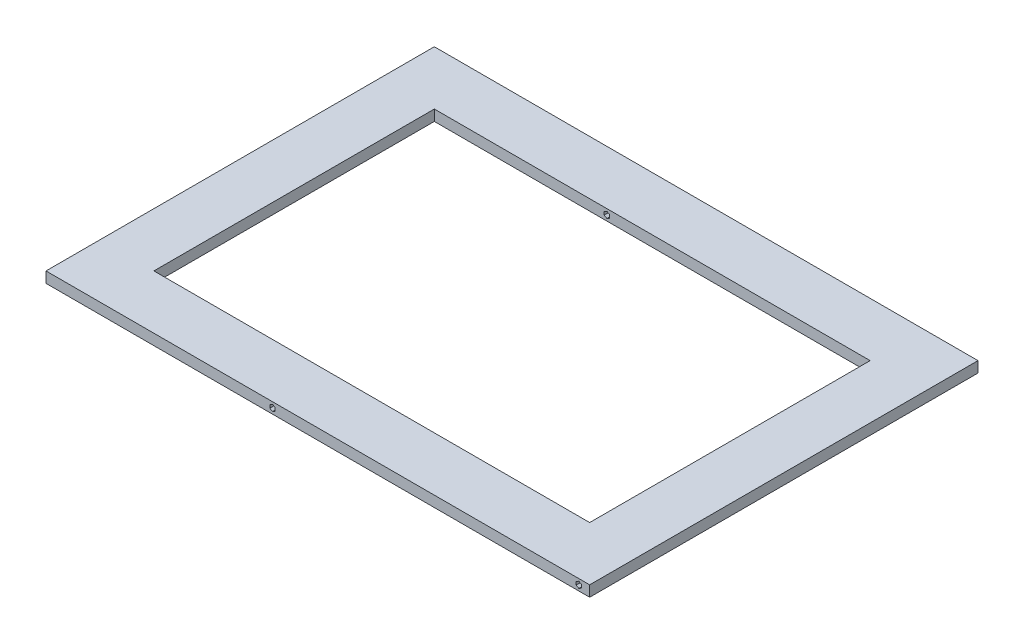
ISO-10303-21;
HEADER;
FILE_DESCRIPTION(('STEP AP214'),'2;1');
FILE_NAME('part.step','',(''),(''),'','','');
FILE_SCHEMA(('AUTOMOTIVE_DESIGN { 1 0 10303 214 1 1 1 1 }'));
ENDSEC;
DATA;
#1=APPLICATION_CONTEXT('core data for automotive mechanical design processes');
#2=APPLICATION_PROTOCOL_DEFINITION('international standard','automotive_design',2000,#1);
#3=PRODUCT_CONTEXT('',#1,'mechanical');
#4=PRODUCT('Part','Part','',(#3));
#5=PRODUCT_RELATED_PRODUCT_CATEGORY('part','',(#4));
#6=PRODUCT_DEFINITION_FORMATION('','',#4);
#7=PRODUCT_DEFINITION_CONTEXT('part definition',#1,'design');
#8=PRODUCT_DEFINITION('design','',#6,#7);
#9=PRODUCT_DEFINITION_SHAPE('','',#8);
#10=(LENGTH_UNIT() NAMED_UNIT(*) SI_UNIT(.MILLI.,.METRE.));
#11=(NAMED_UNIT(*) PLANE_ANGLE_UNIT() SI_UNIT($,.RADIAN.));
#12=(NAMED_UNIT(*) SI_UNIT($,.STERADIAN.) SOLID_ANGLE_UNIT());
#13=UNCERTAINTY_MEASURE_WITH_UNIT(LENGTH_MEASURE(1.E-05),#10,'distance_accuracy_value','');
#14=(GEOMETRIC_REPRESENTATION_CONTEXT(3) GLOBAL_UNCERTAINTY_ASSIGNED_CONTEXT((#13)) GLOBAL_UNIT_ASSIGNED_CONTEXT((#10,
#11,#12)) REPRESENTATION_CONTEXT('',''));
#15=CARTESIAN_POINT('',(0.,0.,0.));
#16=DIRECTION('',(0.,0.,1.));
#17=DIRECTION('',(1.,0.,0.));
#18=AXIS2_PLACEMENT_3D('',#15,#16,#17);
#19=CARTESIAN_POINT('',(-19.75,0.721687836487036,-90.));
#20=DIRECTION('',(0.499999999999999,0.866025403784439,0.));
#21=DIRECTION('',(-0.866025403784439,0.499999999999999,0.));
#22=AXIS2_PLACEMENT_3D('',#19,#20,#21);
#23=PLANE('',#22);
#24=DIRECTION('',(0.,0.,1.));
#25=VECTOR('',#24,1.);
#26=CARTESIAN_POINT('',(-19.75,0.721687836487036,-90.));
#27=LINE('',#26,#25);
#28=CARTESIAN_POINT('',(-19.75,0.721687836487036,-90.));
#29=VERTEX_POINT('',#28);
#30=CARTESIAN_POINT('',(-19.75,0.721687836487036,-65.));
#31=VERTEX_POINT('',#30);
#32=EDGE_CURVE('E340',#29,#31,#27,.T.);
#33=ORIENTED_EDGE('',*,*,#32,.T.);
#34=DIRECTION('',(-0.866025403784439,0.499999999999999,0.));
#35=VECTOR('',#34,1.);
#36=CARTESIAN_POINT('',(-19.75,0.721687836487036,-65.));
#37=LINE('',#36,#35);
#38=CARTESIAN_POINT('',(-21.0000000000001,1.44337567297409,-65.));
#39=VERTEX_POINT('',#38);
#40=EDGE_CURVE('E298',#31,#39,#37,.T.);
#41=ORIENTED_EDGE('',*,*,#40,.T.);
#42=DIRECTION('',(0.,0.,1.));
#43=VECTOR('',#42,1.);
#44=CARTESIAN_POINT('',(-21.0000000000001,1.44337567297409,-90.));
#45=LINE('',#44,#43);
#46=CARTESIAN_POINT('',(-21.0000000000001,1.44337567297409,-90.));
#47=VERTEX_POINT('',#46);
#48=EDGE_CURVE('E361',#47,#39,#45,.T.);
#49=ORIENTED_EDGE('',*,*,#48,.F.);
#50=DIRECTION('',(-0.866025403784439,0.499999999999999,0.));
#51=VECTOR('',#50,1.);
#52=CARTESIAN_POINT('',(-19.75,0.721687836487036,-90.));
#53=LINE('',#52,#51);
#54=EDGE_CURVE('E302',#29,#47,#53,.T.);
#55=ORIENTED_EDGE('',*,*,#54,.F.);
#56=EDGE_LOOP('',(#33,#41,#49,#55));
#57=FACE_BOUND('',#56,.T.);
#58=ADVANCED_FACE('F45',(#57),#23,.F.);
#59=CARTESIAN_POINT('',(-19.75,-0.721687836487042,-90.));
#60=DIRECTION('',(1.,0.,0.));
#61=DIRECTION('',(0.,0.,-1.));
#62=AXIS2_PLACEMENT_3D('',#59,#60,#61);
#63=PLANE('',#62);
#64=DIRECTION('',(0.,0.,1.));
#65=VECTOR('',#64,1.);
#66=CARTESIAN_POINT('',(-19.75,-0.721687836487042,-90.));
#67=LINE('',#66,#65);
#68=CARTESIAN_POINT('',(-19.75,-0.721687836487042,-90.));
#69=VERTEX_POINT('',#68);
#70=CARTESIAN_POINT('',(-19.75,-0.721687836487042,-65.));
#71=VERTEX_POINT('',#70);
#72=EDGE_CURVE('E345',#69,#71,#67,.T.);
#73=ORIENTED_EDGE('',*,*,#72,.T.);
#74=DIRECTION('',(0.,1.,0.));
#75=VECTOR('',#74,1.);
#76=CARTESIAN_POINT('',(-19.75,-0.721687836487042,-65.));
#77=LINE('',#76,#75);
#78=EDGE_CURVE('E295',#71,#31,#77,.T.);
#79=ORIENTED_EDGE('',*,*,#78,.T.);
#80=ORIENTED_EDGE('',*,*,#32,.F.);
#81=DIRECTION('',(0.,1.,0.));
#82=VECTOR('',#81,1.);
#83=CARTESIAN_POINT('',(-19.75,-0.721687836487042,-90.));
#84=LINE('',#83,#82);
#85=EDGE_CURVE('E318',#69,#29,#84,.T.);
#86=ORIENTED_EDGE('',*,*,#85,.F.);
#87=EDGE_LOOP('',(#73,#79,#80,#86));
#88=FACE_BOUND('',#87,.T.);
#89=ADVANCED_FACE('F498',(#88),#63,.F.);
#90=CARTESIAN_POINT('',(-21.0000000000001,-1.44337567297406,-90.));
#91=DIRECTION('',(0.49999999999998,-0.86602540378445,0.));
#92=DIRECTION('',(0.86602540378445,0.49999999999998,0.));
#93=AXIS2_PLACEMENT_3D('',#90,#91,#92);
#94=PLANE('',#93);
#95=DIRECTION('',(0.,0.,1.));
#96=VECTOR('',#95,1.);
#97=CARTESIAN_POINT('',(-21.0000000000001,-1.44337567297406,-90.));
#98=LINE('',#97,#96);
#99=CARTESIAN_POINT('',(-21.0000000000001,-1.44337567297406,-90.));
#100=VERTEX_POINT('',#99);
#101=CARTESIAN_POINT('',(-21.0000000000001,-1.44337567297406,-65.));
#102=VERTEX_POINT('',#101);
#103=EDGE_CURVE('E349',#100,#102,#98,.T.);
#104=ORIENTED_EDGE('',*,*,#103,.T.);
#105=DIRECTION('',(0.86602540378445,0.49999999999998,0.));
#106=VECTOR('',#105,1.);
#107=CARTESIAN_POINT('',(-21.0000000000001,-1.44337567297406,-65.));
#108=LINE('',#107,#106);
#109=EDGE_CURVE('E292',#102,#71,#108,.T.);
#110=ORIENTED_EDGE('',*,*,#109,.T.);
#111=ORIENTED_EDGE('',*,*,#72,.F.);
#112=DIRECTION('',(0.86602540378445,0.49999999999998,0.));
#113=VECTOR('',#112,1.);
#114=CARTESIAN_POINT('',(-21.0000000000001,-1.44337567297406,-90.));
#115=LINE('',#114,#113);
#116=EDGE_CURVE('E315',#100,#69,#115,.T.);
#117=ORIENTED_EDGE('',*,*,#116,.F.);
#118=EDGE_LOOP('',(#104,#110,#111,#117));
#119=FACE_BOUND('',#118,.T.);
#120=ADVANCED_FACE('F504',(#119),#94,.F.);
#121=CARTESIAN_POINT('',(-22.2500000000001,-0.721687836487034,-90.));
#122=DIRECTION('',(-0.5,-0.866025403784438,0.));
#123=DIRECTION('',(0.866025403784439,-0.5,0.));
#124=AXIS2_PLACEMENT_3D('',#121,#122,#123);
#125=PLANE('',#124);
#126=DIRECTION('',(0.,0.,1.));
#127=VECTOR('',#126,1.);
#128=CARTESIAN_POINT('',(-22.2500000000001,-0.721687836487034,-90.));
#129=LINE('',#128,#127);
#130=CARTESIAN_POINT('',(-22.2500000000001,-0.721687836487034,-90.));
#131=VERTEX_POINT('',#130);
#132=CARTESIAN_POINT('',(-22.2500000000001,-0.721687836487034,-65.));
#133=VERTEX_POINT('',#132);
#134=EDGE_CURVE('E353',#131,#133,#129,.T.);
#135=ORIENTED_EDGE('',*,*,#134,.T.);
#136=DIRECTION('',(0.866025403784439,-0.5,0.));
#137=VECTOR('',#136,1.);
#138=CARTESIAN_POINT('',(-22.2500000000001,-0.721687836487034,-65.));
#139=LINE('',#138,#137);
#140=EDGE_CURVE('E289',#133,#102,#139,.T.);
#141=ORIENTED_EDGE('',*,*,#140,.T.);
#142=ORIENTED_EDGE('',*,*,#103,.F.);
#143=DIRECTION('',(0.866025403784439,-0.5,0.));
#144=VECTOR('',#143,1.);
#145=CARTESIAN_POINT('',(-22.2500000000001,-0.721687836487034,-90.));
#146=LINE('',#145,#144);
#147=EDGE_CURVE('E312',#131,#100,#146,.T.);
#148=ORIENTED_EDGE('',*,*,#147,.F.);
#149=EDGE_LOOP('',(#135,#141,#142,#148));
#150=FACE_BOUND('',#149,.T.);
#151=ADVANCED_FACE('F581',(#150),#125,.F.);
#152=CARTESIAN_POINT('',(-22.2500000000001,0.72168783648705,-90.));
#153=DIRECTION('',(-1.,0.,0.));
#154=DIRECTION('',(0.,-1.,0.));
#155=AXIS2_PLACEMENT_3D('',#152,#153,#154);
#156=PLANE('',#155);
#157=DIRECTION('',(0.,0.,1.));
#158=VECTOR('',#157,1.);
#159=CARTESIAN_POINT('',(-22.2500000000001,0.72168783648705,-90.));
#160=LINE('',#159,#158);
#161=CARTESIAN_POINT('',(-22.2500000000001,0.72168783648705,-90.));
#162=VERTEX_POINT('',#161);
#163=CARTESIAN_POINT('',(-22.2500000000001,0.72168783648705,-65.));
#164=VERTEX_POINT('',#163);
#165=EDGE_CURVE('E357',#162,#164,#160,.T.);
#166=ORIENTED_EDGE('',*,*,#165,.T.);
#167=DIRECTION('',(0.,-1.,0.));
#168=VECTOR('',#167,1.);
#169=CARTESIAN_POINT('',(-22.2500000000001,0.72168783648705,-65.));
#170=LINE('',#169,#168);
#171=EDGE_CURVE('E286',#164,#133,#170,.T.);
#172=ORIENTED_EDGE('',*,*,#171,.T.);
#173=ORIENTED_EDGE('',*,*,#134,.F.);
#174=DIRECTION('',(0.,-1.,0.));
#175=VECTOR('',#174,1.);
#176=CARTESIAN_POINT('',(-22.2500000000001,0.72168783648705,-90.));
#177=LINE('',#176,#175);
#178=EDGE_CURVE('E309',#162,#131,#177,.T.);
#179=ORIENTED_EDGE('',*,*,#178,.F.);
#180=EDGE_LOOP('',(#166,#172,#173,#179));
#181=FACE_BOUND('',#180,.T.);
#182=ADVANCED_FACE('F576',(#181),#156,.F.);
#183=CARTESIAN_POINT('',(-21.0000000000001,1.44337567297409,-90.));
#184=DIRECTION('',(-0.5,0.866025403784438,0.));
#185=DIRECTION('',(-0.866025403784439,-0.5,0.));
#186=AXIS2_PLACEMENT_3D('',#183,#184,#185);
#187=PLANE('',#186);
#188=ORIENTED_EDGE('',*,*,#48,.T.);
#189=DIRECTION('',(-0.866025403784439,-0.5,0.));
#190=VECTOR('',#189,1.);
#191=CARTESIAN_POINT('',(-21.0000000000001,1.44337567297409,-65.));
#192=LINE('',#191,#190);
#193=EDGE_CURVE('E11',#39,#164,#192,.T.);
#194=ORIENTED_EDGE('',*,*,#193,.T.);
#195=ORIENTED_EDGE('',*,*,#165,.F.);
#196=DIRECTION('',(-0.866025403784438,-0.5,0.));
#197=VECTOR('',#196,1.);
#198=CARTESIAN_POINT('',(-21.0000000000001,1.44337567297409,-90.));
#199=LINE('',#198,#197);
#200=EDGE_CURVE('E305',#47,#162,#199,.T.);
#201=ORIENTED_EDGE('',*,*,#200,.F.);
#202=EDGE_LOOP('',(#188,#194,#195,#201));
#203=FACE_BOUND('',#202,.T.);
#204=ADVANCED_FACE('F572',(#203),#187,.F.);
#205=CARTESIAN_POINT('',(126.,-2.5,-90.));
#206=DIRECTION('',(1.,0.,0.));
#207=DIRECTION('',(0.,0.,-1.));
#208=AXIS2_PLACEMENT_3D('',#205,#206,#207);
#209=PLANE('',#208);
#210=DIRECTION('',(0.,0.,1.));
#211=VECTOR('',#210,1.);
#212=CARTESIAN_POINT('',(126.,2.5,-90.));
#213=LINE('',#212,#211);
#214=CARTESIAN_POINT('',(126.,2.5,-90.));
#215=VERTEX_POINT('',#214);
#216=CARTESIAN_POINT('',(126.,2.5,90.));
#217=VERTEX_POINT('',#216);
#218=EDGE_CURVE('E457',#215,#217,#213,.T.);
#219=ORIENTED_EDGE('',*,*,#218,.T.);
#220=DIRECTION('',(0.,1.,0.));
#221=VECTOR('',#220,1.);
#222=CARTESIAN_POINT('',(126.,-2.5,90.));
#223=LINE('',#222,#221);
#224=CARTESIAN_POINT('',(126.,-2.5,90.));
#225=VERTEX_POINT('',#224);
#226=EDGE_CURVE('E343',#225,#217,#223,.T.);
#227=ORIENTED_EDGE('',*,*,#226,.F.);
#228=DIRECTION('',(0.,0.,1.));
#229=VECTOR('',#228,1.);
#230=CARTESIAN_POINT('',(126.,-2.5,-90.));
#231=LINE('',#230,#229);
#232=CARTESIAN_POINT('',(126.,-2.5,-90.));
#233=VERTEX_POINT('',#232);
#234=EDGE_CURVE('E458',#233,#225,#231,.T.);
#235=ORIENTED_EDGE('',*,*,#234,.F.);
#236=DIRECTION('',(0.,1.,0.));
#237=VECTOR('',#236,1.);
#238=CARTESIAN_POINT('',(126.,-2.5,-90.));
#239=LINE('',#238,#237);
#240=EDGE_CURVE('E442',#233,#215,#239,.T.);
#241=ORIENTED_EDGE('',*,*,#240,.T.);
#242=EDGE_LOOP('',(#219,#227,#235,#241));
#243=FACE_BOUND('',#242,.T.);
#244=ADVANCED_FACE('F47',(#243),#209,.T.);
#245=CARTESIAN_POINT('',(-126.,-2.5,-90.));
#246=DIRECTION('',(0.,-1.,0.));
#247=DIRECTION('',(0.,0.,-1.));
#248=AXIS2_PLACEMENT_3D('',#245,#246,#247);
#249=PLANE('',#248);
#250=DIRECTION('',(-1.,0.,0.));
#251=VECTOR('',#250,1.);
#252=CARTESIAN_POINT('',(101.,-2.5,-65.));
#253=LINE('',#252,#251);
#254=CARTESIAN_POINT('',(101.,-2.5,-65.));
#255=VERTEX_POINT('',#254);
#256=CARTESIAN_POINT('',(-101.,-2.5,-65.));
#257=VERTEX_POINT('',#256);
#258=EDGE_CURVE('E237',#255,#257,#253,.T.);
#259=ORIENTED_EDGE('',*,*,#258,.T.);
#260=DIRECTION('',(0.,0.,1.));
#261=VECTOR('',#260,1.);
#262=CARTESIAN_POINT('',(-101.,-2.5,-65.));
#263=LINE('',#262,#261);
#264=CARTESIAN_POINT('',(-101.,-2.5,65.));
#265=VERTEX_POINT('',#264);
#266=EDGE_CURVE('E246',#257,#265,#263,.T.);
#267=ORIENTED_EDGE('',*,*,#266,.T.);
#268=DIRECTION('',(1.,0.,0.));
#269=VECTOR('',#268,1.);
#270=CARTESIAN_POINT('',(-101.,-2.5,65.));
#271=LINE('',#270,#269);
#272=CARTESIAN_POINT('',(101.,-2.5,65.));
#273=VERTEX_POINT('',#272);
#274=EDGE_CURVE('E60',#265,#273,#271,.T.);
#275=ORIENTED_EDGE('',*,*,#274,.T.);
#276=DIRECTION('',(0.,0.,-1.));
#277=VECTOR('',#276,1.);
#278=CARTESIAN_POINT('',(101.,-2.5,65.));
#279=LINE('',#278,#277);
#280=EDGE_CURVE('E243',#273,#255,#279,.T.);
#281=ORIENTED_EDGE('',*,*,#280,.T.);
#282=EDGE_LOOP('',(#259,#267,#275,#281));
#283=FACE_BOUND('',#282,.T.);
#284=ORIENTED_EDGE('',*,*,#234,.T.);
#285=DIRECTION('',(1.,0.,0.));
#286=VECTOR('',#285,1.);
#287=CARTESIAN_POINT('',(-126.,-2.5,90.));
#288=LINE('',#287,#286);
#289=CARTESIAN_POINT('',(-126.,-2.5,90.));
#290=VERTEX_POINT('',#289);
#291=EDGE_CURVE('E438',#290,#225,#288,.T.);
#292=ORIENTED_EDGE('',*,*,#291,.F.);
#293=DIRECTION('',(0.,0.,1.));
#294=VECTOR('',#293,1.);
#295=CARTESIAN_POINT('',(-126.,-2.5,-90.));
#296=LINE('',#295,#294);
#297=CARTESIAN_POINT('',(-126.,-2.5,-90.));
#298=VERTEX_POINT('',#297);
#299=EDGE_CURVE('E461',#298,#290,#296,.T.);
#300=ORIENTED_EDGE('',*,*,#299,.F.);
#301=DIRECTION('',(1.,0.,0.));
#302=VECTOR('',#301,1.);
#303=CARTESIAN_POINT('',(-126.,-2.5,-90.));
#304=LINE('',#303,#302);
#305=EDGE_CURVE('E453',#298,#233,#304,.T.);
#306=ORIENTED_EDGE('',*,*,#305,.T.);
#307=EDGE_LOOP('',(#284,#292,#300,#306));
#308=FACE_BOUND('',#307,.T.);
#309=ADVANCED_FACE('F250',(#283,#308),#249,.T.);
#310=CARTESIAN_POINT('',(-126.,-2.5,-90.));
#311=DIRECTION('',(-1.,0.,0.));
#312=DIRECTION('',(0.,0.,1.));
#313=AXIS2_PLACEMENT_3D('',#310,#311,#312);
#314=PLANE('',#313);
#315=ORIENTED_EDGE('',*,*,#299,.T.);
#316=DIRECTION('',(0.,-1.,0.));
#317=VECTOR('',#316,1.);
#318=CARTESIAN_POINT('',(-126.,-2.5,90.));
#319=LINE('',#318,#317);
#320=CARTESIAN_POINT('',(-126.,2.5,90.));
#321=VERTEX_POINT('',#320);
#322=EDGE_CURVE('E435',#321,#290,#319,.T.);
#323=ORIENTED_EDGE('',*,*,#322,.F.);
#324=DIRECTION('',(0.,0.,1.));
#325=VECTOR('',#324,1.);
#326=CARTESIAN_POINT('',(-126.,2.5,-90.));
#327=LINE('',#326,#325);
#328=CARTESIAN_POINT('',(-126.,2.5,-90.));
#329=VERTEX_POINT('',#328);
#330=EDGE_CURVE('E463',#329,#321,#327,.T.);
#331=ORIENTED_EDGE('',*,*,#330,.F.);
#332=DIRECTION('',(0.,-1.,0.));
#333=VECTOR('',#332,1.);
#334=CARTESIAN_POINT('',(-126.,-2.5,-90.));
#335=LINE('',#334,#333);
#336=EDGE_CURVE('E450',#329,#298,#335,.T.);
#337=ORIENTED_EDGE('',*,*,#336,.T.);
#338=EDGE_LOOP('',(#315,#323,#331,#337));
#339=FACE_BOUND('',#338,.T.);
#340=ADVANCED_FACE('F550',(#339),#314,.T.);
#341=CARTESIAN_POINT('',(-126.,2.5,-90.));
#342=DIRECTION('',(0.,1.,0.));
#343=DIRECTION('',(0.,0.,1.));
#344=AXIS2_PLACEMENT_3D('',#341,#342,#343);
#345=PLANE('',#344);
#346=DIRECTION('',(-1.,0.,0.));
#347=VECTOR('',#346,1.);
#348=CARTESIAN_POINT('',(101.,2.5,-65.));
#349=LINE('',#348,#347);
#350=CARTESIAN_POINT('',(101.,2.5,-65.));
#351=VERTEX_POINT('',#350);
#352=CARTESIAN_POINT('',(-101.,2.5,-65.));
#353=VERTEX_POINT('',#352);
#354=EDGE_CURVE('E68',#351,#353,#349,.T.);
#355=ORIENTED_EDGE('',*,*,#354,.F.);
#356=DIRECTION('',(0.,0.,-1.));
#357=VECTOR('',#356,1.);
#358=CARTESIAN_POINT('',(101.,2.5,65.));
#359=LINE('',#358,#357);
#360=CARTESIAN_POINT('',(101.,2.5,65.));
#361=VERTEX_POINT('',#360);
#362=EDGE_CURVE('E253',#361,#351,#359,.T.);
#363=ORIENTED_EDGE('',*,*,#362,.F.);
#364=DIRECTION('',(1.,0.,0.));
#365=VECTOR('',#364,1.);
#366=CARTESIAN_POINT('',(-101.,2.5,65.));
#367=LINE('',#366,#365);
#368=CARTESIAN_POINT('',(-101.,2.5,65.));
#369=VERTEX_POINT('',#368);
#370=EDGE_CURVE('E256',#369,#361,#367,.T.);
#371=ORIENTED_EDGE('',*,*,#370,.F.);
#372=DIRECTION('',(0.,0.,1.));
#373=VECTOR('',#372,1.);
#374=CARTESIAN_POINT('',(-101.,2.5,-65.));
#375=LINE('',#374,#373);
#376=EDGE_CURVE('E262',#353,#369,#375,.T.);
#377=ORIENTED_EDGE('',*,*,#376,.F.);
#378=EDGE_LOOP('',(#355,#363,#371,#377));
#379=FACE_BOUND('',#378,.T.);
#380=ORIENTED_EDGE('',*,*,#330,.T.);
#381=DIRECTION('',(-1.,0.,0.));
#382=VECTOR('',#381,1.);
#383=CARTESIAN_POINT('',(-126.,2.5,90.));
#384=LINE('',#383,#382);
#385=EDGE_CURVE('E431',#217,#321,#384,.T.);
#386=ORIENTED_EDGE('',*,*,#385,.F.);
#387=ORIENTED_EDGE('',*,*,#218,.F.);
#388=DIRECTION('',(-1.,0.,0.));
#389=VECTOR('',#388,1.);
#390=CARTESIAN_POINT('',(-126.,2.5,-90.));
#391=LINE('',#390,#389);
#392=EDGE_CURVE('E446',#215,#329,#391,.T.);
#393=ORIENTED_EDGE('',*,*,#392,.T.);
#394=EDGE_LOOP('',(#380,#386,#387,#393));
#395=FACE_BOUND('',#394,.T.);
#396=ADVANCED_FACE('F546',(#379,#395),#345,.T.);
#397=CARTESIAN_POINT('',(0.,0.,-90.));
#398=DIRECTION('',(0.,0.,-1.));
#399=DIRECTION('',(-1.,0.,0.));
#400=AXIS2_PLACEMENT_3D('',#397,#398,#399);
#401=PLANE('',#400);
#402=ORIENTED_EDGE('',*,*,#54,.T.);
#403=ORIENTED_EDGE('',*,*,#200,.T.);
#404=ORIENTED_EDGE('',*,*,#178,.T.);
#405=ORIENTED_EDGE('',*,*,#147,.T.);
#406=ORIENTED_EDGE('',*,*,#116,.T.);
#407=ORIENTED_EDGE('',*,*,#85,.T.);
#408=EDGE_LOOP('',(#402,#403,#404,#405,#406,#407));
#409=FACE_BOUND('',#408,.T.);
#410=DIRECTION('',(-0.866025403784439,0.499999999999999,0.));
#411=VECTOR('',#410,1.);
#412=CARTESIAN_POINT('',(122.25,0.721687836487021,-90.));
#413=LINE('',#412,#411);
#414=CARTESIAN_POINT('',(122.25,0.721687836487021,-90.));
#415=VERTEX_POINT('',#414);
#416=CARTESIAN_POINT('',(121.,1.44337567297406,-90.));
#417=VERTEX_POINT('',#416);
#418=EDGE_CURVE('E388',#415,#417,#413,.T.);
#419=ORIENTED_EDGE('',*,*,#418,.T.);
#420=DIRECTION('',(-0.866025403784438,-0.500000000000001,0.));
#421=VECTOR('',#420,1.);
#422=CARTESIAN_POINT('',(121.,1.44337567297406,-90.));
#423=LINE('',#422,#421);
#424=CARTESIAN_POINT('',(119.75,0.721687836487024,-90.));
#425=VERTEX_POINT('',#424);
#426=EDGE_CURVE('E421',#417,#425,#423,.T.);
#427=ORIENTED_EDGE('',*,*,#426,.T.);
#428=DIRECTION('',(0.,-1.,0.));
#429=VECTOR('',#428,1.);
#430=CARTESIAN_POINT('',(119.75,0.721687836487033,-90.));
#431=LINE('',#430,#429);
#432=CARTESIAN_POINT('',(119.75,-0.721687836487032,-90.));
#433=VERTEX_POINT('',#432);
#434=EDGE_CURVE('E417',#425,#433,#431,.T.);
#435=ORIENTED_EDGE('',*,*,#434,.T.);
#436=DIRECTION('',(0.866025403784438,-0.500000000000001,0.));
#437=VECTOR('',#436,1.);
#438=CARTESIAN_POINT('',(119.75,-0.721687836487032,-90.));
#439=LINE('',#438,#437);
#440=CARTESIAN_POINT('',(121.,-1.44337567297407,-90.));
#441=VERTEX_POINT('',#440);
#442=EDGE_CURVE('E413',#433,#441,#439,.T.);
#443=ORIENTED_EDGE('',*,*,#442,.T.);
#444=DIRECTION('',(0.866025403784439,0.499999999999999,0.));
#445=VECTOR('',#444,1.);
#446=CARTESIAN_POINT('',(121.,-1.44337567297407,-90.));
#447=LINE('',#446,#445);
#448=CARTESIAN_POINT('',(122.25,-0.721687836487036,-90.));
#449=VERTEX_POINT('',#448);
#450=EDGE_CURVE('E409',#441,#449,#447,.T.);
#451=ORIENTED_EDGE('',*,*,#450,.T.);
#452=DIRECTION('',(0.,1.,0.));
#453=VECTOR('',#452,1.);
#454=CARTESIAN_POINT('',(122.25,-0.721687836487036,-90.));
#455=LINE('',#454,#453);
#456=EDGE_CURVE('E368',#449,#415,#455,.T.);
#457=ORIENTED_EDGE('',*,*,#456,.T.);
#458=EDGE_LOOP('',(#419,#427,#435,#443,#451,#457));
#459=FACE_BOUND('',#458,.T.);
#460=ORIENTED_EDGE('',*,*,#240,.F.);
#461=ORIENTED_EDGE('',*,*,#305,.F.);
#462=ORIENTED_EDGE('',*,*,#336,.F.);
#463=ORIENTED_EDGE('',*,*,#392,.F.);
#464=EDGE_LOOP('',(#460,#461,#462,#463));
#465=FACE_BOUND('',#464,.T.);
#466=ADVANCED_FACE('F543',(#409,#459,#465),#401,.T.);
#467=CARTESIAN_POINT('',(0.,0.,90.));
#468=DIRECTION('',(0.,0.,-1.));
#469=DIRECTION('',(-1.,0.,0.));
#470=AXIS2_PLACEMENT_3D('',#467,#468,#469);
#471=PLANE('',#470);
#472=DIRECTION('',(-0.866025403784438,-0.5,0.));
#473=VECTOR('',#472,1.);
#474=CARTESIAN_POINT('',(-21.0000000000001,1.44337567297409,90.));
#475=LINE('',#474,#473);
#476=CARTESIAN_POINT('',(-21.0000000000001,1.44337567297409,90.));
#477=VERTEX_POINT('',#476);
#478=CARTESIAN_POINT('',(-22.2500000000001,0.72168783648705,90.));
#479=VERTEX_POINT('',#478);
#480=EDGE_CURVE('E325',#477,#479,#475,.T.);
#481=ORIENTED_EDGE('',*,*,#480,.F.);
#482=DIRECTION('',(-0.866025403784439,0.499999999999999,0.));
#483=VECTOR('',#482,1.);
#484=CARTESIAN_POINT('',(-19.75,0.721687836487036,90.));
#485=LINE('',#484,#483);
#486=CARTESIAN_POINT('',(-19.75,0.721687836487036,90.));
#487=VERTEX_POINT('',#486);
#488=EDGE_CURVE('E322',#487,#477,#485,.T.);
#489=ORIENTED_EDGE('',*,*,#488,.F.);
#490=DIRECTION('',(0.,1.,0.));
#491=VECTOR('',#490,1.);
#492=CARTESIAN_POINT('',(-19.75,-0.721687836487042,90.));
#493=LINE('',#492,#491);
#494=CARTESIAN_POINT('',(-19.75,-0.721687836487042,90.));
#495=VERTEX_POINT('',#494);
#496=EDGE_CURVE('E306',#495,#487,#493,.T.);
#497=ORIENTED_EDGE('',*,*,#496,.F.);
#498=DIRECTION('',(0.86602540378445,0.49999999999998,0.));
#499=VECTOR('',#498,1.);
#500=CARTESIAN_POINT('',(-21.0000000000001,-1.44337567297406,90.));
#501=LINE('',#500,#499);
#502=CARTESIAN_POINT('',(-21.0000000000001,-1.44337567297406,90.));
#503=VERTEX_POINT('',#502);
#504=EDGE_CURVE('E335',#503,#495,#501,.T.);
#505=ORIENTED_EDGE('',*,*,#504,.F.);
#506=DIRECTION('',(0.866025403784439,-0.5,0.));
#507=VECTOR('',#506,1.);
#508=CARTESIAN_POINT('',(-22.2500000000001,-0.721687836487034,90.));
#509=LINE('',#508,#507);
#510=CARTESIAN_POINT('',(-22.2500000000001,-0.721687836487034,90.));
#511=VERTEX_POINT('',#510);
#512=EDGE_CURVE('E332',#511,#503,#509,.T.);
#513=ORIENTED_EDGE('',*,*,#512,.F.);
#514=DIRECTION('',(0.,-1.,0.));
#515=VECTOR('',#514,1.);
#516=CARTESIAN_POINT('',(-22.2500000000001,0.72168783648705,90.));
#517=LINE('',#516,#515);
#518=EDGE_CURVE('E329',#479,#511,#517,.T.);
#519=ORIENTED_EDGE('',*,*,#518,.F.);
#520=EDGE_LOOP('',(#481,#489,#497,#505,#513,#519));
#521=FACE_BOUND('',#520,.T.);
#522=DIRECTION('',(-0.866025403784438,-0.500000000000001,0.));
#523=VECTOR('',#522,1.);
#524=CARTESIAN_POINT('',(121.,1.44337567297406,90.));
#525=LINE('',#524,#523);
#526=CARTESIAN_POINT('',(121.,1.44337567297407,90.));
#527=VERTEX_POINT('',#526);
#528=CARTESIAN_POINT('',(119.75,0.721687836487033,90.));
#529=VERTEX_POINT('',#528);
#530=EDGE_CURVE('E400',#527,#529,#525,.T.);
#531=ORIENTED_EDGE('',*,*,#530,.F.);
#532=DIRECTION('',(-0.866025403784439,0.499999999999999,0.));
#533=VECTOR('',#532,1.);
#534=CARTESIAN_POINT('',(122.25,0.721687836487021,90.));
#535=LINE('',#534,#533);
#536=CARTESIAN_POINT('',(122.25,0.721687836487021,90.));
#537=VERTEX_POINT('',#536);
#538=EDGE_CURVE('E326',#537,#527,#535,.T.);
#539=ORIENTED_EDGE('',*,*,#538,.F.);
#540=DIRECTION('',(0.,1.,0.));
#541=VECTOR('',#540,1.);
#542=CARTESIAN_POINT('',(122.25,-0.721687836487036,90.));
#543=LINE('',#542,#541);
#544=CARTESIAN_POINT('',(122.25,-0.721687836487036,90.));
#545=VERTEX_POINT('',#544);
#546=EDGE_CURVE('E383',#545,#537,#543,.T.);
#547=ORIENTED_EDGE('',*,*,#546,.F.);
#548=DIRECTION('',(0.866025403784439,0.499999999999999,0.));
#549=VECTOR('',#548,1.);
#550=CARTESIAN_POINT('',(121.,-1.44337567297407,90.));
#551=LINE('',#550,#549);
#552=CARTESIAN_POINT('',(121.,-1.44337567297407,90.));
#553=VERTEX_POINT('',#552);
#554=EDGE_CURVE('E387',#553,#545,#551,.T.);
#555=ORIENTED_EDGE('',*,*,#554,.F.);
#556=DIRECTION('',(0.866025403784438,-0.500000000000001,0.));
#557=VECTOR('',#556,1.);
#558=CARTESIAN_POINT('',(119.75,-0.721687836487032,90.));
#559=LINE('',#558,#557);
#560=CARTESIAN_POINT('',(119.75,-0.721687836487032,90.));
#561=VERTEX_POINT('',#560);
#562=EDGE_CURVE('E392',#561,#553,#559,.T.);
#563=ORIENTED_EDGE('',*,*,#562,.F.);
#564=DIRECTION('',(0.,-1.,0.));
#565=VECTOR('',#564,1.);
#566=CARTESIAN_POINT('',(119.75,0.721687836487033,90.));
#567=LINE('',#566,#565);
#568=EDGE_CURVE('E396',#529,#561,#567,.T.);
#569=ORIENTED_EDGE('',*,*,#568,.F.);
#570=EDGE_LOOP('',(#531,#539,#547,#555,#563,#569));
#571=FACE_BOUND('',#570,.T.);
#572=ORIENTED_EDGE('',*,*,#226,.T.);
#573=ORIENTED_EDGE('',*,*,#385,.T.);
#574=ORIENTED_EDGE('',*,*,#322,.T.);
#575=ORIENTED_EDGE('',*,*,#291,.T.);
#576=EDGE_LOOP('',(#572,#573,#574,#575));
#577=FACE_BOUND('',#576,.T.);
#578=ADVANCED_FACE('F480',(#521,#571,#577),#471,.F.);
#579=CARTESIAN_POINT('',(122.25,0.721687836487021,-90.));
#580=DIRECTION('',(0.499999999999999,0.866025403784439,0.));
#581=DIRECTION('',(-0.866025403784439,0.499999999999999,0.));
#582=AXIS2_PLACEMENT_3D('',#579,#580,#581);
#583=PLANE('',#582);
#584=ORIENTED_EDGE('',*,*,#538,.T.);
#585=DIRECTION('',(0.,0.,1.));
#586=VECTOR('',#585,1.);
#587=CARTESIAN_POINT('',(121.,1.44337567297406,-90.));
#588=LINE('',#587,#586);
#589=EDGE_CURVE('E364',#417,#527,#588,.T.);
#590=ORIENTED_EDGE('',*,*,#589,.F.);
#591=ORIENTED_EDGE('',*,*,#418,.F.);
#592=DIRECTION('',(0.,0.,1.));
#593=VECTOR('',#592,1.);
#594=CARTESIAN_POINT('',(122.25,0.721687836487021,-90.));
#595=LINE('',#594,#593);
#596=EDGE_CURVE('E301',#415,#537,#595,.T.);
#597=ORIENTED_EDGE('',*,*,#596,.T.);
#598=EDGE_LOOP('',(#584,#590,#591,#597));
#599=FACE_BOUND('',#598,.T.);
#600=ADVANCED_FACE('F518',(#599),#583,.F.);
#601=CARTESIAN_POINT('',(122.25,-0.721687836487036,-90.));
#602=DIRECTION('',(1.,0.,0.));
#603=DIRECTION('',(0.,0.,-1.));
#604=AXIS2_PLACEMENT_3D('',#601,#602,#603);
#605=PLANE('',#604);
#606=ORIENTED_EDGE('',*,*,#546,.T.);
#607=ORIENTED_EDGE('',*,*,#596,.F.);
#608=ORIENTED_EDGE('',*,*,#456,.F.);
#609=DIRECTION('',(0.,0.,1.));
#610=VECTOR('',#609,1.);
#611=CARTESIAN_POINT('',(122.25,-0.721687836487036,-90.));
#612=LINE('',#611,#610);
#613=EDGE_CURVE('E378',#449,#545,#612,.T.);
#614=ORIENTED_EDGE('',*,*,#613,.T.);
#615=EDGE_LOOP('',(#606,#607,#608,#614));
#616=FACE_BOUND('',#615,.T.);
#617=ADVANCED_FACE('F521',(#616),#605,.F.);
#618=CARTESIAN_POINT('',(121.,-1.44337567297407,-90.));
#619=DIRECTION('',(0.499999999999999,-0.866025403784439,0.));
#620=DIRECTION('',(0.866025403784439,0.499999999999999,0.));
#621=AXIS2_PLACEMENT_3D('',#618,#619,#620);
#622=PLANE('',#621);
#623=ORIENTED_EDGE('',*,*,#554,.T.);
#624=ORIENTED_EDGE('',*,*,#613,.F.);
#625=ORIENTED_EDGE('',*,*,#450,.F.);
#626=DIRECTION('',(0.,0.,1.));
#627=VECTOR('',#626,1.);
#628=CARTESIAN_POINT('',(121.,-1.44337567297407,-90.));
#629=LINE('',#628,#627);
#630=EDGE_CURVE('E375',#441,#553,#629,.T.);
#631=ORIENTED_EDGE('',*,*,#630,.T.);
#632=EDGE_LOOP('',(#623,#624,#625,#631));
#633=FACE_BOUND('',#632,.T.);
#634=ADVANCED_FACE('F533',(#633),#622,.F.);
#635=CARTESIAN_POINT('',(119.75,-0.721687836487032,-90.));
#636=DIRECTION('',(-0.500000000000001,-0.866025403784438,0.));
#637=DIRECTION('',(0.866025403784438,-0.500000000000001,0.));
#638=AXIS2_PLACEMENT_3D('',#635,#636,#637);
#639=PLANE('',#638);
#640=ORIENTED_EDGE('',*,*,#562,.T.);
#641=ORIENTED_EDGE('',*,*,#630,.F.);
#642=ORIENTED_EDGE('',*,*,#442,.F.);
#643=DIRECTION('',(0.,0.,1.));
#644=VECTOR('',#643,1.);
#645=CARTESIAN_POINT('',(119.75,-0.721687836487032,-90.));
#646=LINE('',#645,#644);
#647=EDGE_CURVE('E372',#433,#561,#646,.T.);
#648=ORIENTED_EDGE('',*,*,#647,.T.);
#649=EDGE_LOOP('',(#640,#641,#642,#648));
#650=FACE_BOUND('',#649,.T.);
#651=ADVANCED_FACE('F529',(#650),#639,.F.);
#652=CARTESIAN_POINT('',(119.75,0.721687836487033,-90.));
#653=DIRECTION('',(-1.,0.,0.));
#654=DIRECTION('',(0.,0.,1.));
#655=AXIS2_PLACEMENT_3D('',#652,#653,#654);
#656=PLANE('',#655);
#657=ORIENTED_EDGE('',*,*,#568,.T.);
#658=ORIENTED_EDGE('',*,*,#647,.F.);
#659=ORIENTED_EDGE('',*,*,#434,.F.);
#660=DIRECTION('',(0.,0.,1.));
#661=VECTOR('',#660,1.);
#662=CARTESIAN_POINT('',(119.75,0.721687836487033,-90.));
#663=LINE('',#662,#661);
#664=EDGE_CURVE('E369',#425,#529,#663,.T.);
#665=ORIENTED_EDGE('',*,*,#664,.T.);
#666=EDGE_LOOP('',(#657,#658,#659,#665));
#667=FACE_BOUND('',#666,.T.);
#668=ADVANCED_FACE('F525',(#667),#656,.F.);
#669=CARTESIAN_POINT('',(121.,1.44337567297406,-90.));
#670=DIRECTION('',(-0.500000000000001,0.866025403784438,0.));
#671=DIRECTION('',(-0.866025403784438,-0.500000000000001,0.));
#672=AXIS2_PLACEMENT_3D('',#669,#670,#671);
#673=PLANE('',#672);
#674=ORIENTED_EDGE('',*,*,#530,.T.);
#675=ORIENTED_EDGE('',*,*,#664,.F.);
#676=ORIENTED_EDGE('',*,*,#426,.F.);
#677=ORIENTED_EDGE('',*,*,#589,.T.);
#678=EDGE_LOOP('',(#674,#675,#676,#677));
#679=FACE_BOUND('',#678,.T.);
#680=ADVANCED_FACE('F505',(#679),#673,.F.);
#681=CARTESIAN_POINT('',(-21.0000000000001,1.44337567297409,64.9999999999999));
#682=VERTEX_POINT('',#681);
#683=EDGE_CURVE('E321',#682,#477,#45,.T.);
#684=ORIENTED_EDGE('',*,*,#683,.F.);
#685=DIRECTION('',(0.866025403784439,-0.499999999999999,0.));
#686=VECTOR('',#685,1.);
#687=CARTESIAN_POINT('',(-19.75,0.721687836487036,65.));
#688=LINE('',#687,#686);
#689=CARTESIAN_POINT('',(-19.75,0.721687836487036,65.));
#690=VERTEX_POINT('',#689);
#691=EDGE_CURVE('E283',#682,#690,#688,.T.);
#692=ORIENTED_EDGE('',*,*,#691,.T.);
#693=EDGE_CURVE('E344',#690,#487,#27,.T.);
#694=ORIENTED_EDGE('',*,*,#693,.T.);
#695=ORIENTED_EDGE('',*,*,#488,.T.);
#696=EDGE_LOOP('',(#684,#692,#694,#695));
#697=FACE_BOUND('',#696,.T.);
#698=ADVANCED_FACE('F473',(#697),#23,.F.);
#699=ORIENTED_EDGE('',*,*,#693,.F.);
#700=DIRECTION('',(0.,-1.,0.));
#701=VECTOR('',#700,1.);
#702=CARTESIAN_POINT('',(-19.75,-0.721687836487042,65.));
#703=LINE('',#702,#701);
#704=CARTESIAN_POINT('',(-19.75,-0.721687836487042,65.));
#705=VERTEX_POINT('',#704);
#706=EDGE_CURVE('E280',#690,#705,#703,.T.);
#707=ORIENTED_EDGE('',*,*,#706,.T.);
#708=EDGE_CURVE('E348',#705,#495,#67,.T.);
#709=ORIENTED_EDGE('',*,*,#708,.T.);
#710=ORIENTED_EDGE('',*,*,#496,.T.);
#711=EDGE_LOOP('',(#699,#707,#709,#710));
#712=FACE_BOUND('',#711,.T.);
#713=ADVANCED_FACE('F495',(#712),#63,.F.);
#714=ORIENTED_EDGE('',*,*,#708,.F.);
#715=DIRECTION('',(-0.86602540378445,-0.49999999999998,0.));
#716=VECTOR('',#715,1.);
#717=CARTESIAN_POINT('',(-21.0000000000001,-1.44337567297406,65.));
#718=LINE('',#717,#716);
#719=CARTESIAN_POINT('',(-21.0000000000001,-1.44337567297406,65.));
#720=VERTEX_POINT('',#719);
#721=EDGE_CURVE('E277',#705,#720,#718,.T.);
#722=ORIENTED_EDGE('',*,*,#721,.T.);
#723=EDGE_CURVE('E352',#720,#503,#98,.T.);
#724=ORIENTED_EDGE('',*,*,#723,.T.);
#725=ORIENTED_EDGE('',*,*,#504,.T.);
#726=EDGE_LOOP('',(#714,#722,#724,#725));
#727=FACE_BOUND('',#726,.T.);
#728=ADVANCED_FACE('F493',(#727),#94,.F.);
#729=ORIENTED_EDGE('',*,*,#723,.F.);
#730=DIRECTION('',(-0.866025403784439,0.5,0.));
#731=VECTOR('',#730,1.);
#732=CARTESIAN_POINT('',(-22.2500000000001,-0.721687836487034,65.));
#733=LINE('',#732,#731);
#734=CARTESIAN_POINT('',(-22.2500000000001,-0.721687836487034,65.));
#735=VERTEX_POINT('',#734);
#736=EDGE_CURVE('E274',#720,#735,#733,.T.);
#737=ORIENTED_EDGE('',*,*,#736,.T.);
#738=EDGE_CURVE('E356',#735,#511,#129,.T.);
#739=ORIENTED_EDGE('',*,*,#738,.T.);
#740=ORIENTED_EDGE('',*,*,#512,.T.);
#741=EDGE_LOOP('',(#729,#737,#739,#740));
#742=FACE_BOUND('',#741,.T.);
#743=ADVANCED_FACE('F490',(#742),#125,.F.);
#744=ORIENTED_EDGE('',*,*,#738,.F.);
#745=DIRECTION('',(0.,1.,0.));
#746=VECTOR('',#745,1.);
#747=CARTESIAN_POINT('',(-22.2500000000001,0.72168783648705,65.));
#748=LINE('',#747,#746);
#749=CARTESIAN_POINT('',(-22.2500000000001,0.721687836487049,65.));
#750=VERTEX_POINT('',#749);
#751=EDGE_CURVE('E268',#735,#750,#748,.T.);
#752=ORIENTED_EDGE('',*,*,#751,.T.);
#753=EDGE_CURVE('E360',#750,#479,#160,.T.);
#754=ORIENTED_EDGE('',*,*,#753,.T.);
#755=ORIENTED_EDGE('',*,*,#518,.T.);
#756=EDGE_LOOP('',(#744,#752,#754,#755));
#757=FACE_BOUND('',#756,.T.);
#758=ADVANCED_FACE('F486',(#757),#156,.F.);
#759=ORIENTED_EDGE('',*,*,#753,.F.);
#760=DIRECTION('',(0.866025403784439,0.5,0.));
#761=VECTOR('',#760,1.);
#762=CARTESIAN_POINT('',(-21.0000000000001,1.44337567297409,65.));
#763=LINE('',#762,#761);
#764=EDGE_CURVE('E53',#750,#682,#763,.T.);
#765=ORIENTED_EDGE('',*,*,#764,.T.);
#766=ORIENTED_EDGE('',*,*,#683,.T.);
#767=ORIENTED_EDGE('',*,*,#480,.T.);
#768=EDGE_LOOP('',(#759,#765,#766,#767));
#769=FACE_BOUND('',#768,.T.);
#770=ADVANCED_FACE('F470',(#769),#187,.F.);
#771=CARTESIAN_POINT('',(101.,-2.5,-65.));
#772=DIRECTION('',(0.,0.,-1.));
#773=DIRECTION('',(-1.,0.,0.));
#774=AXIS2_PLACEMENT_3D('',#771,#772,#773);
#775=PLANE('',#774);
#776=ORIENTED_EDGE('',*,*,#354,.T.);
#777=DIRECTION('',(0.,1.,0.));
#778=VECTOR('',#777,1.);
#779=CARTESIAN_POINT('',(-101.,-2.5,-65.));
#780=LINE('',#779,#778);
#781=EDGE_CURVE('E232',#257,#353,#780,.T.);
#782=ORIENTED_EDGE('',*,*,#781,.F.);
#783=ORIENTED_EDGE('',*,*,#258,.F.);
#784=DIRECTION('',(0.,1.,0.));
#785=VECTOR('',#784,1.);
#786=CARTESIAN_POINT('',(101.,-2.5,-65.));
#787=LINE('',#786,#785);
#788=EDGE_CURVE('E266',#255,#351,#787,.T.);
#789=ORIENTED_EDGE('',*,*,#788,.T.);
#790=EDGE_LOOP('',(#776,#782,#783,#789));
#791=FACE_BOUND('',#790,.T.);
#792=ORIENTED_EDGE('',*,*,#78,.F.);
#793=ORIENTED_EDGE('',*,*,#109,.F.);
#794=ORIENTED_EDGE('',*,*,#140,.F.);
#795=ORIENTED_EDGE('',*,*,#171,.F.);
#796=ORIENTED_EDGE('',*,*,#193,.F.);
#797=ORIENTED_EDGE('',*,*,#40,.F.);
#798=EDGE_LOOP('',(#792,#793,#794,#795,#796,#797));
#799=FACE_BOUND('',#798,.T.);
#800=ADVANCED_FACE('F234',(#791,#799),#775,.F.);
#801=CARTESIAN_POINT('',(-101.,-2.5,65.));
#802=DIRECTION('',(0.,0.,1.));
#803=DIRECTION('',(1.,0.,0.));
#804=AXIS2_PLACEMENT_3D('',#801,#802,#803);
#805=PLANE('',#804);
#806=ORIENTED_EDGE('',*,*,#370,.T.);
#807=DIRECTION('',(0.,1.,0.));
#808=VECTOR('',#807,1.);
#809=CARTESIAN_POINT('',(101.,-2.5,65.));
#810=LINE('',#809,#808);
#811=EDGE_CURVE('E269',#273,#361,#810,.T.);
#812=ORIENTED_EDGE('',*,*,#811,.F.);
#813=ORIENTED_EDGE('',*,*,#274,.F.);
#814=DIRECTION('',(0.,1.,0.));
#815=VECTOR('',#814,1.);
#816=CARTESIAN_POINT('',(-101.,-2.5,65.));
#817=LINE('',#816,#815);
#818=EDGE_CURVE('E242',#265,#369,#817,.T.);
#819=ORIENTED_EDGE('',*,*,#818,.T.);
#820=EDGE_LOOP('',(#806,#812,#813,#819));
#821=FACE_BOUND('',#820,.T.);
#822=ORIENTED_EDGE('',*,*,#764,.F.);
#823=ORIENTED_EDGE('',*,*,#751,.F.);
#824=ORIENTED_EDGE('',*,*,#736,.F.);
#825=ORIENTED_EDGE('',*,*,#721,.F.);
#826=ORIENTED_EDGE('',*,*,#706,.F.);
#827=ORIENTED_EDGE('',*,*,#691,.F.);
#828=EDGE_LOOP('',(#822,#823,#824,#825,#826,#827));
#829=FACE_BOUND('',#828,.T.);
#830=ADVANCED_FACE('F487',(#821,#829),#805,.F.);
#831=CARTESIAN_POINT('',(101.,-2.5,65.));
#832=DIRECTION('',(1.,0.,0.));
#833=DIRECTION('',(0.,0.,-1.));
#834=AXIS2_PLACEMENT_3D('',#831,#832,#833);
#835=PLANE('',#834);
#836=ORIENTED_EDGE('',*,*,#362,.T.);
#837=ORIENTED_EDGE('',*,*,#788,.F.);
#838=ORIENTED_EDGE('',*,*,#280,.F.);
#839=ORIENTED_EDGE('',*,*,#811,.T.);
#840=EDGE_LOOP('',(#836,#837,#838,#839));
#841=FACE_BOUND('',#840,.T.);
#842=ADVANCED_FACE('F643',(#841),#835,.F.);
#843=CARTESIAN_POINT('',(-101.,-2.5,-65.));
#844=DIRECTION('',(-1.,0.,0.));
#845=DIRECTION('',(0.,0.,1.));
#846=AXIS2_PLACEMENT_3D('',#843,#844,#845);
#847=PLANE('',#846);
#848=ORIENTED_EDGE('',*,*,#376,.T.);
#849=ORIENTED_EDGE('',*,*,#818,.F.);
#850=ORIENTED_EDGE('',*,*,#266,.F.);
#851=ORIENTED_EDGE('',*,*,#781,.T.);
#852=EDGE_LOOP('',(#848,#849,#850,#851));
#853=FACE_BOUND('',#852,.T.);
#854=ADVANCED_FACE('F247',(#853),#847,.F.);
#855=CLOSED_SHELL('',(#58,#89,#120,#151,#182,#204,#244,#309,#340,#396,#466,#578,#600,#617,#634,
#651,#668,#680,#698,#713,#728,#743,#758,#770,#800,#830,#842,#854));
#856=MANIFOLD_SOLID_BREP('B2',#855);
#857=ADVANCED_BREP_SHAPE_REPRESENTATION('',(#18,#856),#14);
#858=SHAPE_DEFINITION_REPRESENTATION(#9,#857);
ENDSEC;
END-ISO-10303-21;
